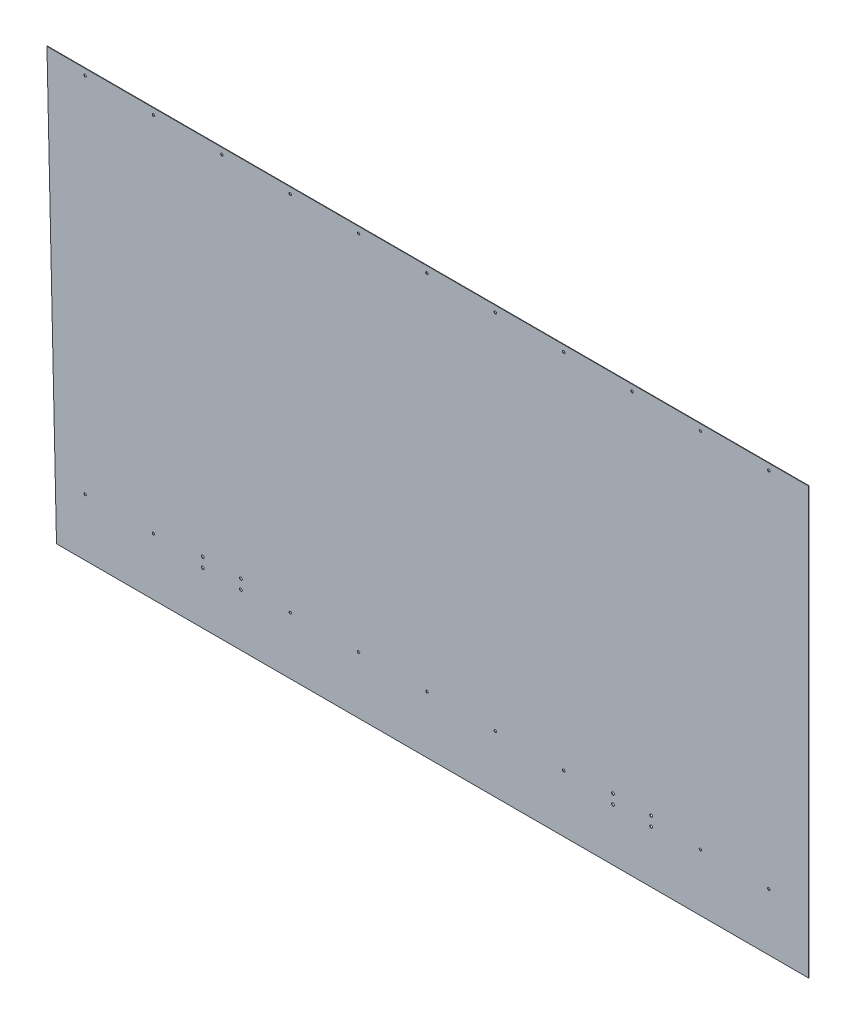
ISO-10303-21;
HEADER;
FILE_DESCRIPTION(('STEP AP214'),'2;1');
FILE_NAME('part.step','',(''),(''),'','','');
FILE_SCHEMA(('AUTOMOTIVE_DESIGN { 1 0 10303 214 1 1 1 1 }'));
ENDSEC;
DATA;
#1=APPLICATION_CONTEXT('core data for automotive mechanical design processes');
#2=APPLICATION_PROTOCOL_DEFINITION('international standard','automotive_design',2000,#1);
#3=PRODUCT_CONTEXT('',#1,'mechanical');
#4=PRODUCT('Part','Part','',(#3));
#5=PRODUCT_RELATED_PRODUCT_CATEGORY('part','',(#4));
#6=PRODUCT_DEFINITION_FORMATION('','',#4);
#7=PRODUCT_DEFINITION_CONTEXT('part definition',#1,'design');
#8=PRODUCT_DEFINITION('design','',#6,#7);
#9=PRODUCT_DEFINITION_SHAPE('','',#8);
#10=(LENGTH_UNIT() NAMED_UNIT(*) SI_UNIT(.MILLI.,.METRE.));
#11=(NAMED_UNIT(*) PLANE_ANGLE_UNIT() SI_UNIT($,.RADIAN.));
#12=(NAMED_UNIT(*) SI_UNIT($,.STERADIAN.) SOLID_ANGLE_UNIT());
#13=UNCERTAINTY_MEASURE_WITH_UNIT(LENGTH_MEASURE(1.E-05),#10,'distance_accuracy_value','');
#14=(GEOMETRIC_REPRESENTATION_CONTEXT(3) GLOBAL_UNCERTAINTY_ASSIGNED_CONTEXT((#13)) GLOBAL_UNIT_ASSIGNED_CONTEXT((#10,
#11,#12)) REPRESENTATION_CONTEXT('',''));
#15=CARTESIAN_POINT('',(0.,0.,0.));
#16=DIRECTION('',(0.,0.,1.));
#17=DIRECTION('',(1.,0.,0.));
#18=AXIS2_PLACEMENT_3D('',#15,#16,#17);
#19=CARTESIAN_POINT('',(-19.0500000000001,850.9,-1.01600000000003));
#20=DIRECTION('',(-0.999749481562088,-0.0223824510797483,0.));
#21=DIRECTION('',(0.0223824510797485,-0.999749481562088,0.));
#22=AXIS2_PLACEMENT_3D('',#19,#20,#21);
#23=PLANE('',#22);
#24=DIRECTION('',(0.0223824510797484,-0.999749481562088,0.));
#25=VECTOR('',#24,1.);
#26=CARTESIAN_POINT('',(-19.0500000000002,850.9,0.));
#27=LINE('',#26,#25);
#28=CARTESIAN_POINT('',(-19.0500000000002,850.9,0.));
#29=VERTEX_POINT('',#28);
#30=CARTESIAN_POINT('',(0.,0.,0.));
#31=VERTEX_POINT('',#30);
#32=EDGE_CURVE('E74',#29,#31,#27,.T.);
#33=ORIENTED_EDGE('',*,*,#32,.F.);
#34=DIRECTION('',(0.,0.,1.));
#35=VECTOR('',#34,1.);
#36=CARTESIAN_POINT('',(-19.0500000000001,850.9,-1.01600000000003));
#37=LINE('',#36,#35);
#38=CARTESIAN_POINT('',(-19.0500000000001,850.9,-1.01600000000003));
#39=VERTEX_POINT('',#38);
#40=EDGE_CURVE('E11',#39,#29,#37,.T.);
#41=ORIENTED_EDGE('',*,*,#40,.F.);
#42=DIRECTION('',(0.0223824510797484,-0.999749481562088,0.));
#43=VECTOR('',#42,1.);
#44=CARTESIAN_POINT('',(-19.0500000000001,850.9,-1.01600000000003));
#45=LINE('',#44,#43);
#46=CARTESIAN_POINT('',(0.,0.,-1.016));
#47=VERTEX_POINT('',#46);
#48=EDGE_CURVE('E76',#39,#47,#45,.T.);
#49=ORIENTED_EDGE('',*,*,#48,.T.);
#50=DIRECTION('',(0.,0.,1.));
#51=VECTOR('',#50,1.);
#52=CARTESIAN_POINT('',(0.,0.,-1.016));
#53=LINE('',#52,#51);
#54=EDGE_CURVE('E37',#47,#31,#53,.T.);
#55=ORIENTED_EDGE('',*,*,#54,.T.);
#56=EDGE_LOOP('',(#33,#41,#49,#55));
#57=FACE_BOUND('',#56,.T.);
#58=ADVANCED_FACE('F34',(#57),#23,.T.);
#59=CARTESIAN_POINT('',(1501.775,850.9,-1.01599999999996));
#60=DIRECTION('',(0.,1.,0.));
#61=DIRECTION('',(-1.,0.,0.));
#62=AXIS2_PLACEMENT_3D('',#59,#60,#61);
#63=PLANE('',#62);
#64=DIRECTION('',(-1.,0.,0.));
#65=VECTOR('',#64,1.);
#66=CARTESIAN_POINT('',(1501.775,850.9,0.));
#67=LINE('',#66,#65);
#68=CARTESIAN_POINT('',(1501.775,850.9,0.));
#69=VERTEX_POINT('',#68);
#70=EDGE_CURVE('E91',#69,#29,#67,.T.);
#71=ORIENTED_EDGE('',*,*,#70,.F.);
#72=DIRECTION('',(0.,0.,1.));
#73=VECTOR('',#72,1.);
#74=CARTESIAN_POINT('',(1501.775,850.9,-1.01599999999996));
#75=LINE('',#74,#73);
#76=CARTESIAN_POINT('',(1501.775,850.9,-1.01599999999996));
#77=VERTEX_POINT('',#76);
#78=EDGE_CURVE('E42',#77,#69,#75,.T.);
#79=ORIENTED_EDGE('',*,*,#78,.F.);
#80=DIRECTION('',(-1.,0.,0.));
#81=VECTOR('',#80,1.);
#82=CARTESIAN_POINT('',(1501.775,850.9,-1.01599999999996));
#83=LINE('',#82,#81);
#84=EDGE_CURVE('E81',#77,#39,#83,.T.);
#85=ORIENTED_EDGE('',*,*,#84,.T.);
#86=ORIENTED_EDGE('',*,*,#40,.T.);
#87=EDGE_LOOP('',(#71,#79,#85,#86));
#88=FACE_BOUND('',#87,.T.);
#89=ADVANCED_FACE('F111',(#88),#63,.T.);
#90=CARTESIAN_POINT('',(1501.775,-1.11022302462516E-13,-1.01599999999993));
#91=DIRECTION('',(1.,0.,0.));
#92=DIRECTION('',(0.,0.,-1.));
#93=AXIS2_PLACEMENT_3D('',#90,#91,#92);
#94=PLANE('',#93);
#95=DIRECTION('',(0.,1.,0.));
#96=VECTOR('',#95,1.);
#97=CARTESIAN_POINT('',(1501.775,-1.11022302462516E-13,0.));
#98=LINE('',#97,#96);
#99=CARTESIAN_POINT('',(1501.775,-1.11022302462516E-13,0.));
#100=VERTEX_POINT('',#99);
#101=EDGE_CURVE('E88',#100,#69,#98,.T.);
#102=ORIENTED_EDGE('',*,*,#101,.F.);
#103=DIRECTION('',(0.,0.,1.));
#104=VECTOR('',#103,1.);
#105=CARTESIAN_POINT('',(1501.775,-1.11022302462516E-13,-1.01599999999993));
#106=LINE('',#105,#104);
#107=CARTESIAN_POINT('',(1501.775,-1.11022302462516E-13,-1.01599999999993));
#108=VERTEX_POINT('',#107);
#109=EDGE_CURVE('E80',#108,#100,#106,.T.);
#110=ORIENTED_EDGE('',*,*,#109,.F.);
#111=DIRECTION('',(0.,1.,0.));
#112=VECTOR('',#111,1.);
#113=CARTESIAN_POINT('',(1501.775,-1.11022302462516E-13,-1.01599999999993));
#114=LINE('',#113,#112);
#115=EDGE_CURVE('E104',#108,#77,#114,.T.);
#116=ORIENTED_EDGE('',*,*,#115,.T.);
#117=ORIENTED_EDGE('',*,*,#78,.T.);
#118=EDGE_LOOP('',(#102,#110,#116,#117));
#119=FACE_BOUND('',#118,.T.);
#120=ADVANCED_FACE('F108',(#119),#94,.T.);
#121=CARTESIAN_POINT('',(0.,0.,-1.016));
#122=DIRECTION('',(0.,-1.,0.));
#123=DIRECTION('',(0.,0.,-1.));
#124=AXIS2_PLACEMENT_3D('',#121,#122,#123);
#125=PLANE('',#124);
#126=DIRECTION('',(1.,0.,0.));
#127=VECTOR('',#126,1.);
#128=CARTESIAN_POINT('',(0.,0.,0.));
#129=LINE('',#128,#127);
#130=EDGE_CURVE('E83',#31,#100,#129,.T.);
#131=ORIENTED_EDGE('',*,*,#130,.F.);
#132=ORIENTED_EDGE('',*,*,#54,.F.);
#133=DIRECTION('',(1.,0.,0.));
#134=VECTOR('',#133,1.);
#135=CARTESIAN_POINT('',(0.,0.,-1.016));
#136=LINE('',#135,#134);
#137=EDGE_CURVE('E102',#47,#108,#136,.T.);
#138=ORIENTED_EDGE('',*,*,#137,.T.);
#139=ORIENTED_EDGE('',*,*,#109,.T.);
#140=EDGE_LOOP('',(#131,#132,#138,#139));
#141=FACE_BOUND('',#140,.T.);
#142=ADVANCED_FACE('F84',(#141),#125,.T.);
#143=CARTESIAN_POINT('',(-19.05,850.9,-1.01600000000002));
#144=DIRECTION('',(0.,0.,-1.));
#145=DIRECTION('',(-1.,0.,0.));
#146=AXIS2_PLACEMENT_3D('',#143,#144,#145);
#147=PLANE('',#146);
#148=CARTESIAN_POINT('',(1422.4,838.2,-1.01600000000002));
#149=DIRECTION('',(0.,0.,1.));
#150=DIRECTION('',(1.,0.,0.));
#151=AXIS2_PLACEMENT_3D('',#148,#149,#150);
#152=CIRCLE('',#151,2.42570000000007);
#153=CARTESIAN_POINT('',(1424.8257,838.2,-1.01600000000002));
#154=VERTEX_POINT('',#153);
#155=EDGE_CURVE('E436',#154,#154,#152,.T.);
#156=ORIENTED_EDGE('',*,*,#155,.T.);
#157=EDGE_LOOP('',(#156));
#158=FACE_BOUND('',#157,.T.);
#159=CARTESIAN_POINT('',(1285.875,838.2,-1.01600000000002));
#160=DIRECTION('',(0.,0.,1.));
#161=DIRECTION('',(1.,0.,0.));
#162=AXIS2_PLACEMENT_3D('',#159,#160,#161);
#163=CIRCLE('',#162,2.42570000000007);
#164=CARTESIAN_POINT('',(1288.3007,838.2,-1.01600000000002));
#165=VERTEX_POINT('',#164);
#166=EDGE_CURVE('E446',#165,#165,#163,.T.);
#167=ORIENTED_EDGE('',*,*,#166,.T.);
#168=EDGE_LOOP('',(#167));
#169=FACE_BOUND('',#168,.T.);
#170=CARTESIAN_POINT('',(1149.35,838.2,-1.01599999999998));
#171=DIRECTION('',(0.,0.,1.));
#172=DIRECTION('',(1.,0.,0.));
#173=AXIS2_PLACEMENT_3D('',#170,#171,#172);
#174=CIRCLE('',#173,2.42570000000007);
#175=CARTESIAN_POINT('',(1151.7757,838.2,-1.01599999999998));
#176=VERTEX_POINT('',#175);
#177=EDGE_CURVE('E452',#176,#176,#174,.T.);
#178=ORIENTED_EDGE('',*,*,#177,.T.);
#179=EDGE_LOOP('',(#178));
#180=FACE_BOUND('',#179,.T.);
#181=CARTESIAN_POINT('',(1012.825,838.2,-1.01599999999996));
#182=DIRECTION('',(0.,0.,1.));
#183=DIRECTION('',(1.,0.,0.));
#184=AXIS2_PLACEMENT_3D('',#181,#182,#183);
#185=CIRCLE('',#184,2.42569999999986);
#186=CARTESIAN_POINT('',(1015.2507,838.2,-1.01599999999996));
#187=VERTEX_POINT('',#186);
#188=EDGE_CURVE('E458',#187,#187,#185,.T.);
#189=ORIENTED_EDGE('',*,*,#188,.T.);
#190=EDGE_LOOP('',(#189));
#191=FACE_BOUND('',#190,.T.);
#192=CARTESIAN_POINT('',(876.3,838.2,-1.01599999999999));
#193=DIRECTION('',(0.,0.,1.));
#194=DIRECTION('',(1.,0.,0.));
#195=AXIS2_PLACEMENT_3D('',#192,#193,#194);
#196=CIRCLE('',#195,2.42569999999997);
#197=CARTESIAN_POINT('',(878.7257,838.2,-1.01599999999999));
#198=VERTEX_POINT('',#197);
#199=EDGE_CURVE('E464',#198,#198,#196,.T.);
#200=ORIENTED_EDGE('',*,*,#199,.T.);
#201=EDGE_LOOP('',(#200));
#202=FACE_BOUND('',#201,.T.);
#203=CARTESIAN_POINT('',(739.775,838.2,-1.01599999999996));
#204=DIRECTION('',(0.,0.,1.));
#205=DIRECTION('',(1.,0.,0.));
#206=AXIS2_PLACEMENT_3D('',#203,#204,#205);
#207=CIRCLE('',#206,2.42569999999997);
#208=CARTESIAN_POINT('',(742.2007,838.2,-1.01599999999996));
#209=VERTEX_POINT('',#208);
#210=EDGE_CURVE('E470',#209,#209,#207,.T.);
#211=ORIENTED_EDGE('',*,*,#210,.T.);
#212=EDGE_LOOP('',(#211));
#213=FACE_BOUND('',#212,.T.);
#214=CARTESIAN_POINT('',(603.25,838.2,-1.01599999999999));
#215=DIRECTION('',(0.,0.,1.));
#216=DIRECTION('',(1.,0.,0.));
#217=AXIS2_PLACEMENT_3D('',#214,#215,#216);
#218=CIRCLE('',#217,2.42569999999997);
#219=CARTESIAN_POINT('',(605.6757,838.2,-1.01599999999999));
#220=VERTEX_POINT('',#219);
#221=EDGE_CURVE('E476',#220,#220,#218,.T.);
#222=ORIENTED_EDGE('',*,*,#221,.T.);
#223=EDGE_LOOP('',(#222));
#224=FACE_BOUND('',#223,.T.);
#225=CARTESIAN_POINT('',(466.725,838.2,-1.01599999999999));
#226=DIRECTION('',(0.,0.,1.));
#227=DIRECTION('',(1.,0.,0.));
#228=AXIS2_PLACEMENT_3D('',#225,#226,#227);
#229=CIRCLE('',#228,2.42569999999997);
#230=CARTESIAN_POINT('',(469.1507,838.2,-1.01599999999999));
#231=VERTEX_POINT('',#230);
#232=EDGE_CURVE('E482',#231,#231,#229,.T.);
#233=ORIENTED_EDGE('',*,*,#232,.T.);
#234=EDGE_LOOP('',(#233));
#235=FACE_BOUND('',#234,.T.);
#236=CARTESIAN_POINT('',(330.2,838.2,-1.016));
#237=DIRECTION('',(0.,0.,1.));
#238=DIRECTION('',(1.,0.,0.));
#239=AXIS2_PLACEMENT_3D('',#236,#237,#238);
#240=CIRCLE('',#239,2.42569999999997);
#241=CARTESIAN_POINT('',(332.6257,838.2,-1.016));
#242=VERTEX_POINT('',#241);
#243=EDGE_CURVE('E488',#242,#242,#240,.T.);
#244=ORIENTED_EDGE('',*,*,#243,.T.);
#245=EDGE_LOOP('',(#244));
#246=FACE_BOUND('',#245,.T.);
#247=CARTESIAN_POINT('',(193.675,838.2,-1.01599999999999));
#248=DIRECTION('',(0.,0.,1.));
#249=DIRECTION('',(1.,0.,0.));
#250=AXIS2_PLACEMENT_3D('',#247,#248,#249);
#251=CIRCLE('',#250,2.42569999999999);
#252=CARTESIAN_POINT('',(196.1007,838.2,-1.01599999999999));
#253=VERTEX_POINT('',#252);
#254=EDGE_CURVE('E494',#253,#253,#251,.T.);
#255=ORIENTED_EDGE('',*,*,#254,.T.);
#256=EDGE_LOOP('',(#255));
#257=FACE_BOUND('',#256,.T.);
#258=CARTESIAN_POINT('',(57.1499999999998,838.2,-1.016));
#259=DIRECTION('',(0.,0.,1.));
#260=DIRECTION('',(1.,0.,0.));
#261=AXIS2_PLACEMENT_3D('',#258,#259,#260);
#262=CIRCLE('',#261,2.42569999999997);
#263=CARTESIAN_POINT('',(59.5756999999998,838.2,-1.016));
#264=VERTEX_POINT('',#263);
#265=EDGE_CURVE('E500',#264,#264,#262,.T.);
#266=ORIENTED_EDGE('',*,*,#265,.T.);
#267=EDGE_LOOP('',(#266));
#268=FACE_BOUND('',#267,.T.);
#269=CARTESIAN_POINT('',(1012.825,114.3,-1.01599999999998));
#270=DIRECTION('',(0.,0.,1.));
#271=DIRECTION('',(1.,0.,0.));
#272=AXIS2_PLACEMENT_3D('',#269,#270,#271);
#273=CIRCLE('',#272,2.38759999999994);
#274=CARTESIAN_POINT('',(1015.2126,114.3,-1.01599999999998));
#275=VERTEX_POINT('',#274);
#276=EDGE_CURVE('E506',#275,#275,#273,.T.);
#277=ORIENTED_EDGE('',*,*,#276,.T.);
#278=EDGE_LOOP('',(#277));
#279=FACE_BOUND('',#278,.T.);
#280=CARTESIAN_POINT('',(1187.45,104.775,-1.01599999999991));
#281=DIRECTION('',(0.,0.,1.));
#282=DIRECTION('',(1.,0.,0.));
#283=AXIS2_PLACEMENT_3D('',#280,#281,#282);
#284=CIRCLE('',#283,2.78130000000002);
#285=CARTESIAN_POINT('',(1190.2313,104.775,-1.01599999999991));
#286=VERTEX_POINT('',#285);
#287=EDGE_CURVE('E512',#286,#286,#284,.T.);
#288=ORIENTED_EDGE('',*,*,#287,.T.);
#289=EDGE_LOOP('',(#288));
#290=FACE_BOUND('',#289,.T.);
#291=CARTESIAN_POINT('',(1187.45,123.825,-1.01599999999991));
#292=DIRECTION('',(0.,0.,1.));
#293=DIRECTION('',(1.,0.,0.));
#294=AXIS2_PLACEMENT_3D('',#291,#292,#293);
#295=CIRCLE('',#294,2.78130000000002);
#296=CARTESIAN_POINT('',(1190.2313,123.825,-1.01599999999991));
#297=VERTEX_POINT('',#296);
#298=EDGE_CURVE('E518',#297,#297,#295,.T.);
#299=ORIENTED_EDGE('',*,*,#298,.T.);
#300=EDGE_LOOP('',(#299));
#301=FACE_BOUND('',#300,.T.);
#302=CARTESIAN_POINT('',(1285.875,114.3,-1.01599999999996));
#303=DIRECTION('',(0.,0.,1.));
#304=DIRECTION('',(1.,0.,0.));
#305=AXIS2_PLACEMENT_3D('',#302,#303,#304);
#306=CIRCLE('',#305,2.38759999999994);
#307=CARTESIAN_POINT('',(1288.2626,114.3,-1.01599999999996));
#308=VERTEX_POINT('',#307);
#309=EDGE_CURVE('E524',#308,#308,#306,.T.);
#310=ORIENTED_EDGE('',*,*,#309,.T.);
#311=EDGE_LOOP('',(#310));
#312=FACE_BOUND('',#311,.T.);
#313=CARTESIAN_POINT('',(876.3,114.3,-1.01599999999999));
#314=DIRECTION('',(0.,0.,1.));
#315=DIRECTION('',(1.,0.,0.));
#316=AXIS2_PLACEMENT_3D('',#313,#314,#315);
#317=CIRCLE('',#316,2.38760000000005);
#318=CARTESIAN_POINT('',(878.6876,114.3,-1.01599999999999));
#319=VERTEX_POINT('',#318);
#320=EDGE_CURVE('E530',#319,#319,#317,.T.);
#321=ORIENTED_EDGE('',*,*,#320,.T.);
#322=EDGE_LOOP('',(#321));
#323=FACE_BOUND('',#322,.T.);
#324=CARTESIAN_POINT('',(368.3,123.825,-1.01599999999999));
#325=DIRECTION('',(0.,0.,1.));
#326=DIRECTION('',(1.,0.,0.));
#327=AXIS2_PLACEMENT_3D('',#324,#325,#326);
#328=CIRCLE('',#327,2.78130000000001);
#329=CARTESIAN_POINT('',(371.0813,123.825,-1.01599999999999));
#330=VERTEX_POINT('',#329);
#331=EDGE_CURVE('E536',#330,#330,#328,.T.);
#332=ORIENTED_EDGE('',*,*,#331,.T.);
#333=EDGE_LOOP('',(#332));
#334=FACE_BOUND('',#333,.T.);
#335=CARTESIAN_POINT('',(368.3,104.775,-1.016));
#336=DIRECTION('',(0.,0.,1.));
#337=DIRECTION('',(1.,0.,0.));
#338=AXIS2_PLACEMENT_3D('',#335,#336,#337);
#339=CIRCLE('',#338,2.78130000000001);
#340=CARTESIAN_POINT('',(371.0813,104.775,-1.016));
#341=VERTEX_POINT('',#340);
#342=EDGE_CURVE('E542',#341,#341,#339,.T.);
#343=ORIENTED_EDGE('',*,*,#342,.T.);
#344=EDGE_LOOP('',(#343));
#345=FACE_BOUND('',#344,.T.);
#346=CARTESIAN_POINT('',(1422.4,114.3,-1.01599999999996));
#347=DIRECTION('',(0.,0.,1.));
#348=DIRECTION('',(1.,0.,0.));
#349=AXIS2_PLACEMENT_3D('',#346,#347,#348);
#350=CIRCLE('',#349,2.38759999999994);
#351=CARTESIAN_POINT('',(1424.7876,114.3,-1.01599999999996));
#352=VERTEX_POINT('',#351);
#353=EDGE_CURVE('E548',#352,#352,#350,.T.);
#354=ORIENTED_EDGE('',*,*,#353,.T.);
#355=EDGE_LOOP('',(#354));
#356=FACE_BOUND('',#355,.T.);
#357=CARTESIAN_POINT('',(1111.25,104.775,-1.01599999999991));
#358=DIRECTION('',(0.,0.,1.));
#359=DIRECTION('',(1.,0.,0.));
#360=AXIS2_PLACEMENT_3D('',#357,#358,#359);
#361=CIRCLE('',#360,2.78130000000002);
#362=CARTESIAN_POINT('',(1114.0313,104.775,-1.01599999999991));
#363=VERTEX_POINT('',#362);
#364=EDGE_CURVE('E554',#363,#363,#361,.T.);
#365=ORIENTED_EDGE('',*,*,#364,.T.);
#366=EDGE_LOOP('',(#365));
#367=FACE_BOUND('',#366,.T.);
#368=CARTESIAN_POINT('',(1111.25,123.825,-1.01599999999991));
#369=DIRECTION('',(0.,0.,1.));
#370=DIRECTION('',(1.,0.,0.));
#371=AXIS2_PLACEMENT_3D('',#368,#369,#370);
#372=CIRCLE('',#371,2.78130000000002);
#373=CARTESIAN_POINT('',(1114.0313,123.825,-1.01599999999991));
#374=VERTEX_POINT('',#373);
#375=EDGE_CURVE('E560',#374,#374,#372,.T.);
#376=ORIENTED_EDGE('',*,*,#375,.T.);
#377=EDGE_LOOP('',(#376));
#378=FACE_BOUND('',#377,.T.);
#379=CARTESIAN_POINT('',(739.775,114.3,-1.01599999999996));
#380=DIRECTION('',(0.,0.,1.));
#381=DIRECTION('',(1.,0.,0.));
#382=AXIS2_PLACEMENT_3D('',#379,#380,#381);
#383=CIRCLE('',#382,2.38760000000005);
#384=CARTESIAN_POINT('',(742.1626,114.3,-1.01599999999996));
#385=VERTEX_POINT('',#384);
#386=EDGE_CURVE('E566',#385,#385,#383,.T.);
#387=ORIENTED_EDGE('',*,*,#386,.T.);
#388=EDGE_LOOP('',(#387));
#389=FACE_BOUND('',#388,.T.);
#390=CARTESIAN_POINT('',(603.25,114.3,-1.01599999999999));
#391=DIRECTION('',(0.,0.,1.));
#392=DIRECTION('',(1.,0.,0.));
#393=AXIS2_PLACEMENT_3D('',#390,#391,#392);
#394=CIRCLE('',#393,2.38760000000005);
#395=CARTESIAN_POINT('',(605.6376,114.3,-1.01599999999999));
#396=VERTEX_POINT('',#395);
#397=EDGE_CURVE('E572',#396,#396,#394,.T.);
#398=ORIENTED_EDGE('',*,*,#397,.T.);
#399=EDGE_LOOP('',(#398));
#400=FACE_BOUND('',#399,.T.);
#401=CARTESIAN_POINT('',(466.725,114.3,-1.016));
#402=DIRECTION('',(0.,0.,1.));
#403=DIRECTION('',(1.,0.,0.));
#404=AXIS2_PLACEMENT_3D('',#401,#402,#403);
#405=CIRCLE('',#404,2.38760000000005);
#406=CARTESIAN_POINT('',(469.1126,114.3,-1.016));
#407=VERTEX_POINT('',#406);
#408=EDGE_CURVE('E578',#407,#407,#405,.T.);
#409=ORIENTED_EDGE('',*,*,#408,.T.);
#410=EDGE_LOOP('',(#409));
#411=FACE_BOUND('',#410,.T.);
#412=CARTESIAN_POINT('',(193.675,114.3,-1.01599999999999));
#413=DIRECTION('',(0.,0.,1.));
#414=DIRECTION('',(1.,0.,0.));
#415=AXIS2_PLACEMENT_3D('',#412,#413,#414);
#416=CIRCLE('',#415,2.38759999999999);
#417=CARTESIAN_POINT('',(196.0626,114.3,-1.01599999999999));
#418=VERTEX_POINT('',#417);
#419=EDGE_CURVE('E584',#418,#418,#416,.T.);
#420=ORIENTED_EDGE('',*,*,#419,.T.);
#421=EDGE_LOOP('',(#420));
#422=FACE_BOUND('',#421,.T.);
#423=CARTESIAN_POINT('',(292.1,123.825,-1.016));
#424=DIRECTION('',(0.,0.,1.));
#425=DIRECTION('',(1.,0.,0.));
#426=AXIS2_PLACEMENT_3D('',#423,#424,#425);
#427=CIRCLE('',#426,2.78130000000001);
#428=CARTESIAN_POINT('',(294.8813,123.825,-1.016));
#429=VERTEX_POINT('',#428);
#430=EDGE_CURVE('E590',#429,#429,#427,.T.);
#431=ORIENTED_EDGE('',*,*,#430,.T.);
#432=EDGE_LOOP('',(#431));
#433=FACE_BOUND('',#432,.T.);
#434=CARTESIAN_POINT('',(292.1,104.775,-1.016));
#435=DIRECTION('',(0.,0.,1.));
#436=DIRECTION('',(1.,0.,0.));
#437=AXIS2_PLACEMENT_3D('',#434,#435,#436);
#438=CIRCLE('',#437,2.78130000000001);
#439=CARTESIAN_POINT('',(294.8813,104.775,-1.016));
#440=VERTEX_POINT('',#439);
#441=EDGE_CURVE('E596',#440,#440,#438,.T.);
#442=ORIENTED_EDGE('',*,*,#441,.T.);
#443=EDGE_LOOP('',(#442));
#444=FACE_BOUND('',#443,.T.);
#445=CARTESIAN_POINT('',(57.1499999999999,114.3,-1.01599999999999));
#446=DIRECTION('',(0.,0.,1.));
#447=DIRECTION('',(1.,0.,0.));
#448=AXIS2_PLACEMENT_3D('',#445,#446,#447);
#449=CIRCLE('',#448,2.3876);
#450=CARTESIAN_POINT('',(59.5375999999999,114.3,-1.01599999999999));
#451=VERTEX_POINT('',#450);
#452=EDGE_CURVE('E92',#451,#451,#449,.T.);
#453=ORIENTED_EDGE('',*,*,#452,.T.);
#454=EDGE_LOOP('',(#453));
#455=FACE_BOUND('',#454,.T.);
#456=ORIENTED_EDGE('',*,*,#48,.F.);
#457=ORIENTED_EDGE('',*,*,#84,.F.);
#458=ORIENTED_EDGE('',*,*,#115,.F.);
#459=ORIENTED_EDGE('',*,*,#137,.F.);
#460=EDGE_LOOP('',(#456,#457,#458,#459));
#461=FACE_BOUND('',#460,.T.);
#462=ADVANCED_FACE('F113',(#158,#169,#180,#191,#202,#213,#224,#235,#246,#257,#268,#279,#290,
#301,#312,#323,#334,#345,#356,#367,#378,#389,#400,#411,#422,#433,#444,#455,#461),#147,.T.);
#463=CARTESIAN_POINT('',(-19.05,850.9,0.));
#464=DIRECTION('',(0.,0.,-1.));
#465=DIRECTION('',(-1.,0.,0.));
#466=AXIS2_PLACEMENT_3D('',#463,#464,#465);
#467=PLANE('',#466);
#468=CARTESIAN_POINT('',(1422.4,838.2,0.));
#469=DIRECTION('',(0.,0.,1.));
#470=DIRECTION('',(1.,0.,0.));
#471=AXIS2_PLACEMENT_3D('',#468,#469,#470);
#472=CIRCLE('',#471,2.42570000000007);
#473=CARTESIAN_POINT('',(1424.8257,838.2,0.));
#474=VERTEX_POINT('',#473);
#475=EDGE_CURVE('E439',#474,#474,#472,.T.);
#476=ORIENTED_EDGE('',*,*,#475,.F.);
#477=EDGE_LOOP('',(#476));
#478=FACE_BOUND('',#477,.T.);
#479=CARTESIAN_POINT('',(1285.875,838.2,0.));
#480=DIRECTION('',(0.,0.,1.));
#481=DIRECTION('',(1.,0.,0.));
#482=AXIS2_PLACEMENT_3D('',#479,#480,#481);
#483=CIRCLE('',#482,2.42570000000007);
#484=CARTESIAN_POINT('',(1288.3007,838.2,0.));
#485=VERTEX_POINT('',#484);
#486=EDGE_CURVE('E441',#485,#485,#483,.T.);
#487=ORIENTED_EDGE('',*,*,#486,.F.);
#488=EDGE_LOOP('',(#487));
#489=FACE_BOUND('',#488,.T.);
#490=CARTESIAN_POINT('',(1149.35,838.2,0.));
#491=DIRECTION('',(0.,0.,1.));
#492=DIRECTION('',(1.,0.,0.));
#493=AXIS2_PLACEMENT_3D('',#490,#491,#492);
#494=CIRCLE('',#493,2.42570000000007);
#495=CARTESIAN_POINT('',(1151.7757,838.2,0.));
#496=VERTEX_POINT('',#495);
#497=EDGE_CURVE('E449',#496,#496,#494,.T.);
#498=ORIENTED_EDGE('',*,*,#497,.F.);
#499=EDGE_LOOP('',(#498));
#500=FACE_BOUND('',#499,.T.);
#501=CARTESIAN_POINT('',(1012.825,838.2,0.));
#502=DIRECTION('',(0.,0.,1.));
#503=DIRECTION('',(1.,0.,0.));
#504=AXIS2_PLACEMENT_3D('',#501,#502,#503);
#505=CIRCLE('',#504,2.42569999999986);
#506=CARTESIAN_POINT('',(1015.2507,838.2,0.));
#507=VERTEX_POINT('',#506);
#508=EDGE_CURVE('E455',#507,#507,#505,.T.);
#509=ORIENTED_EDGE('',*,*,#508,.F.);
#510=EDGE_LOOP('',(#509));
#511=FACE_BOUND('',#510,.T.);
#512=CARTESIAN_POINT('',(876.3,838.2,0.));
#513=DIRECTION('',(0.,0.,1.));
#514=DIRECTION('',(1.,0.,0.));
#515=AXIS2_PLACEMENT_3D('',#512,#513,#514);
#516=CIRCLE('',#515,2.42569999999997);
#517=CARTESIAN_POINT('',(878.7257,838.2,0.));
#518=VERTEX_POINT('',#517);
#519=EDGE_CURVE('E461',#518,#518,#516,.T.);
#520=ORIENTED_EDGE('',*,*,#519,.F.);
#521=EDGE_LOOP('',(#520));
#522=FACE_BOUND('',#521,.T.);
#523=CARTESIAN_POINT('',(739.775,838.2,0.));
#524=DIRECTION('',(0.,0.,1.));
#525=DIRECTION('',(1.,0.,0.));
#526=AXIS2_PLACEMENT_3D('',#523,#524,#525);
#527=CIRCLE('',#526,2.42569999999997);
#528=CARTESIAN_POINT('',(742.2007,838.2,0.));
#529=VERTEX_POINT('',#528);
#530=EDGE_CURVE('E467',#529,#529,#527,.T.);
#531=ORIENTED_EDGE('',*,*,#530,.F.);
#532=EDGE_LOOP('',(#531));
#533=FACE_BOUND('',#532,.T.);
#534=CARTESIAN_POINT('',(603.25,838.2,0.));
#535=DIRECTION('',(0.,0.,1.));
#536=DIRECTION('',(1.,0.,0.));
#537=AXIS2_PLACEMENT_3D('',#534,#535,#536);
#538=CIRCLE('',#537,2.42569999999997);
#539=CARTESIAN_POINT('',(605.6757,838.2,0.));
#540=VERTEX_POINT('',#539);
#541=EDGE_CURVE('E473',#540,#540,#538,.T.);
#542=ORIENTED_EDGE('',*,*,#541,.F.);
#543=EDGE_LOOP('',(#542));
#544=FACE_BOUND('',#543,.T.);
#545=CARTESIAN_POINT('',(466.725,838.2,0.));
#546=DIRECTION('',(0.,0.,1.));
#547=DIRECTION('',(1.,0.,0.));
#548=AXIS2_PLACEMENT_3D('',#545,#546,#547);
#549=CIRCLE('',#548,2.42569999999997);
#550=CARTESIAN_POINT('',(469.1507,838.2,0.));
#551=VERTEX_POINT('',#550);
#552=EDGE_CURVE('E479',#551,#551,#549,.T.);
#553=ORIENTED_EDGE('',*,*,#552,.F.);
#554=EDGE_LOOP('',(#553));
#555=FACE_BOUND('',#554,.T.);
#556=CARTESIAN_POINT('',(330.2,838.2,0.));
#557=DIRECTION('',(0.,0.,1.));
#558=DIRECTION('',(1.,0.,0.));
#559=AXIS2_PLACEMENT_3D('',#556,#557,#558);
#560=CIRCLE('',#559,2.42569999999997);
#561=CARTESIAN_POINT('',(332.6257,838.2,0.));
#562=VERTEX_POINT('',#561);
#563=EDGE_CURVE('E485',#562,#562,#560,.T.);
#564=ORIENTED_EDGE('',*,*,#563,.F.);
#565=EDGE_LOOP('',(#564));
#566=FACE_BOUND('',#565,.T.);
#567=CARTESIAN_POINT('',(193.675,838.2,0.));
#568=DIRECTION('',(0.,0.,1.));
#569=DIRECTION('',(1.,0.,0.));
#570=AXIS2_PLACEMENT_3D('',#567,#568,#569);
#571=CIRCLE('',#570,2.42569999999999);
#572=CARTESIAN_POINT('',(196.1007,838.2,0.));
#573=VERTEX_POINT('',#572);
#574=EDGE_CURVE('E491',#573,#573,#571,.T.);
#575=ORIENTED_EDGE('',*,*,#574,.F.);
#576=EDGE_LOOP('',(#575));
#577=FACE_BOUND('',#576,.T.);
#578=CARTESIAN_POINT('',(57.1499999999999,838.2,0.));
#579=DIRECTION('',(0.,0.,1.));
#580=DIRECTION('',(1.,0.,0.));
#581=AXIS2_PLACEMENT_3D('',#578,#579,#580);
#582=CIRCLE('',#581,2.42569999999997);
#583=CARTESIAN_POINT('',(59.5756999999999,838.2,0.));
#584=VERTEX_POINT('',#583);
#585=EDGE_CURVE('E497',#584,#584,#582,.T.);
#586=ORIENTED_EDGE('',*,*,#585,.F.);
#587=EDGE_LOOP('',(#586));
#588=FACE_BOUND('',#587,.T.);
#589=CARTESIAN_POINT('',(1012.825,114.3,0.));
#590=DIRECTION('',(0.,0.,1.));
#591=DIRECTION('',(1.,0.,0.));
#592=AXIS2_PLACEMENT_3D('',#589,#590,#591);
#593=CIRCLE('',#592,2.38759999999994);
#594=CARTESIAN_POINT('',(1015.2126,114.3,0.));
#595=VERTEX_POINT('',#594);
#596=EDGE_CURVE('E503',#595,#595,#593,.T.);
#597=ORIENTED_EDGE('',*,*,#596,.F.);
#598=EDGE_LOOP('',(#597));
#599=FACE_BOUND('',#598,.T.);
#600=CARTESIAN_POINT('',(1187.45,104.775,0.));
#601=DIRECTION('',(0.,0.,1.));
#602=DIRECTION('',(1.,0.,0.));
#603=AXIS2_PLACEMENT_3D('',#600,#601,#602);
#604=CIRCLE('',#603,2.78130000000002);
#605=CARTESIAN_POINT('',(1190.2313,104.775,0.));
#606=VERTEX_POINT('',#605);
#607=EDGE_CURVE('E509',#606,#606,#604,.T.);
#608=ORIENTED_EDGE('',*,*,#607,.F.);
#609=EDGE_LOOP('',(#608));
#610=FACE_BOUND('',#609,.T.);
#611=CARTESIAN_POINT('',(1187.45,123.825,0.));
#612=DIRECTION('',(0.,0.,1.));
#613=DIRECTION('',(1.,0.,0.));
#614=AXIS2_PLACEMENT_3D('',#611,#612,#613);
#615=CIRCLE('',#614,2.78130000000002);
#616=CARTESIAN_POINT('',(1190.2313,123.825,0.));
#617=VERTEX_POINT('',#616);
#618=EDGE_CURVE('E515',#617,#617,#615,.T.);
#619=ORIENTED_EDGE('',*,*,#618,.F.);
#620=EDGE_LOOP('',(#619));
#621=FACE_BOUND('',#620,.T.);
#622=CARTESIAN_POINT('',(1285.875,114.3,0.));
#623=DIRECTION('',(0.,0.,1.));
#624=DIRECTION('',(1.,0.,0.));
#625=AXIS2_PLACEMENT_3D('',#622,#623,#624);
#626=CIRCLE('',#625,2.38759999999994);
#627=CARTESIAN_POINT('',(1288.2626,114.3,0.));
#628=VERTEX_POINT('',#627);
#629=EDGE_CURVE('E521',#628,#628,#626,.T.);
#630=ORIENTED_EDGE('',*,*,#629,.F.);
#631=EDGE_LOOP('',(#630));
#632=FACE_BOUND('',#631,.T.);
#633=CARTESIAN_POINT('',(876.3,114.3,0.));
#634=DIRECTION('',(0.,0.,1.));
#635=DIRECTION('',(1.,0.,0.));
#636=AXIS2_PLACEMENT_3D('',#633,#634,#635);
#637=CIRCLE('',#636,2.38760000000005);
#638=CARTESIAN_POINT('',(878.6876,114.3,0.));
#639=VERTEX_POINT('',#638);
#640=EDGE_CURVE('E527',#639,#639,#637,.T.);
#641=ORIENTED_EDGE('',*,*,#640,.F.);
#642=EDGE_LOOP('',(#641));
#643=FACE_BOUND('',#642,.T.);
#644=CARTESIAN_POINT('',(368.3,123.825,0.));
#645=DIRECTION('',(0.,0.,1.));
#646=DIRECTION('',(1.,0.,0.));
#647=AXIS2_PLACEMENT_3D('',#644,#645,#646);
#648=CIRCLE('',#647,2.78130000000001);
#649=CARTESIAN_POINT('',(371.0813,123.825,0.));
#650=VERTEX_POINT('',#649);
#651=EDGE_CURVE('E533',#650,#650,#648,.T.);
#652=ORIENTED_EDGE('',*,*,#651,.F.);
#653=EDGE_LOOP('',(#652));
#654=FACE_BOUND('',#653,.T.);
#655=CARTESIAN_POINT('',(368.3,104.775,0.));
#656=DIRECTION('',(0.,0.,1.));
#657=DIRECTION('',(1.,0.,0.));
#658=AXIS2_PLACEMENT_3D('',#655,#656,#657);
#659=CIRCLE('',#658,2.78130000000001);
#660=CARTESIAN_POINT('',(371.0813,104.775,0.));
#661=VERTEX_POINT('',#660);
#662=EDGE_CURVE('E539',#661,#661,#659,.T.);
#663=ORIENTED_EDGE('',*,*,#662,.F.);
#664=EDGE_LOOP('',(#663));
#665=FACE_BOUND('',#664,.T.);
#666=CARTESIAN_POINT('',(1422.4,114.3,0.));
#667=DIRECTION('',(0.,0.,1.));
#668=DIRECTION('',(1.,0.,0.));
#669=AXIS2_PLACEMENT_3D('',#666,#667,#668);
#670=CIRCLE('',#669,2.38759999999994);
#671=CARTESIAN_POINT('',(1424.7876,114.3,0.));
#672=VERTEX_POINT('',#671);
#673=EDGE_CURVE('E545',#672,#672,#670,.T.);
#674=ORIENTED_EDGE('',*,*,#673,.F.);
#675=EDGE_LOOP('',(#674));
#676=FACE_BOUND('',#675,.T.);
#677=CARTESIAN_POINT('',(1111.25,104.775,0.));
#678=DIRECTION('',(0.,0.,1.));
#679=DIRECTION('',(1.,0.,0.));
#680=AXIS2_PLACEMENT_3D('',#677,#678,#679);
#681=CIRCLE('',#680,2.78130000000002);
#682=CARTESIAN_POINT('',(1114.0313,104.775,0.));
#683=VERTEX_POINT('',#682);
#684=EDGE_CURVE('E551',#683,#683,#681,.T.);
#685=ORIENTED_EDGE('',*,*,#684,.F.);
#686=EDGE_LOOP('',(#685));
#687=FACE_BOUND('',#686,.T.);
#688=CARTESIAN_POINT('',(1111.25,123.825,0.));
#689=DIRECTION('',(0.,0.,1.));
#690=DIRECTION('',(1.,0.,0.));
#691=AXIS2_PLACEMENT_3D('',#688,#689,#690);
#692=CIRCLE('',#691,2.78130000000002);
#693=CARTESIAN_POINT('',(1114.0313,123.825,0.));
#694=VERTEX_POINT('',#693);
#695=EDGE_CURVE('E557',#694,#694,#692,.T.);
#696=ORIENTED_EDGE('',*,*,#695,.F.);
#697=EDGE_LOOP('',(#696));
#698=FACE_BOUND('',#697,.T.);
#699=CARTESIAN_POINT('',(739.775,114.3,0.));
#700=DIRECTION('',(0.,0.,1.));
#701=DIRECTION('',(1.,0.,0.));
#702=AXIS2_PLACEMENT_3D('',#699,#700,#701);
#703=CIRCLE('',#702,2.38760000000005);
#704=CARTESIAN_POINT('',(742.1626,114.3,0.));
#705=VERTEX_POINT('',#704);
#706=EDGE_CURVE('E563',#705,#705,#703,.T.);
#707=ORIENTED_EDGE('',*,*,#706,.F.);
#708=EDGE_LOOP('',(#707));
#709=FACE_BOUND('',#708,.T.);
#710=CARTESIAN_POINT('',(603.25,114.3,0.));
#711=DIRECTION('',(0.,0.,1.));
#712=DIRECTION('',(1.,0.,0.));
#713=AXIS2_PLACEMENT_3D('',#710,#711,#712);
#714=CIRCLE('',#713,2.38760000000005);
#715=CARTESIAN_POINT('',(605.6376,114.3,0.));
#716=VERTEX_POINT('',#715);
#717=EDGE_CURVE('E569',#716,#716,#714,.T.);
#718=ORIENTED_EDGE('',*,*,#717,.F.);
#719=EDGE_LOOP('',(#718));
#720=FACE_BOUND('',#719,.T.);
#721=CARTESIAN_POINT('',(466.725,114.3,0.));
#722=DIRECTION('',(0.,0.,1.));
#723=DIRECTION('',(1.,0.,0.));
#724=AXIS2_PLACEMENT_3D('',#721,#722,#723);
#725=CIRCLE('',#724,2.38760000000005);
#726=CARTESIAN_POINT('',(469.1126,114.3,0.));
#727=VERTEX_POINT('',#726);
#728=EDGE_CURVE('E575',#727,#727,#725,.T.);
#729=ORIENTED_EDGE('',*,*,#728,.F.);
#730=EDGE_LOOP('',(#729));
#731=FACE_BOUND('',#730,.T.);
#732=CARTESIAN_POINT('',(193.675,114.3,0.));
#733=DIRECTION('',(0.,0.,1.));
#734=DIRECTION('',(1.,0.,0.));
#735=AXIS2_PLACEMENT_3D('',#732,#733,#734);
#736=CIRCLE('',#735,2.38759999999999);
#737=CARTESIAN_POINT('',(196.0626,114.3,0.));
#738=VERTEX_POINT('',#737);
#739=EDGE_CURVE('E581',#738,#738,#736,.T.);
#740=ORIENTED_EDGE('',*,*,#739,.F.);
#741=EDGE_LOOP('',(#740));
#742=FACE_BOUND('',#741,.T.);
#743=CARTESIAN_POINT('',(292.1,123.825,0.));
#744=DIRECTION('',(0.,0.,1.));
#745=DIRECTION('',(1.,0.,0.));
#746=AXIS2_PLACEMENT_3D('',#743,#744,#745);
#747=CIRCLE('',#746,2.78130000000001);
#748=CARTESIAN_POINT('',(294.8813,123.825,0.));
#749=VERTEX_POINT('',#748);
#750=EDGE_CURVE('E587',#749,#749,#747,.T.);
#751=ORIENTED_EDGE('',*,*,#750,.F.);
#752=EDGE_LOOP('',(#751));
#753=FACE_BOUND('',#752,.T.);
#754=CARTESIAN_POINT('',(292.1,104.775,0.));
#755=DIRECTION('',(0.,0.,1.));
#756=DIRECTION('',(1.,0.,0.));
#757=AXIS2_PLACEMENT_3D('',#754,#755,#756);
#758=CIRCLE('',#757,2.78130000000001);
#759=CARTESIAN_POINT('',(294.8813,104.775,0.));
#760=VERTEX_POINT('',#759);
#761=EDGE_CURVE('E593',#760,#760,#758,.T.);
#762=ORIENTED_EDGE('',*,*,#761,.F.);
#763=EDGE_LOOP('',(#762));
#764=FACE_BOUND('',#763,.T.);
#765=CARTESIAN_POINT('',(57.15,114.3,0.));
#766=DIRECTION('',(0.,0.,1.));
#767=DIRECTION('',(1.,0.,0.));
#768=AXIS2_PLACEMENT_3D('',#765,#766,#767);
#769=CIRCLE('',#768,2.3876);
#770=CARTESIAN_POINT('',(59.5376,114.3,0.));
#771=VERTEX_POINT('',#770);
#772=EDGE_CURVE('E95',#771,#771,#769,.T.);
#773=ORIENTED_EDGE('',*,*,#772,.F.);
#774=EDGE_LOOP('',(#773));
#775=FACE_BOUND('',#774,.T.);
#776=ORIENTED_EDGE('',*,*,#32,.T.);
#777=ORIENTED_EDGE('',*,*,#130,.T.);
#778=ORIENTED_EDGE('',*,*,#101,.T.);
#779=ORIENTED_EDGE('',*,*,#70,.T.);
#780=EDGE_LOOP('',(#776,#777,#778,#779));
#781=FACE_BOUND('',#780,.T.);
#782=ADVANCED_FACE('F90',(#478,#489,#500,#511,#522,#533,#544,#555,#566,#577,#588,#599,#610,#621,
#632,#643,#654,#665,#676,#687,#698,#709,#720,#731,#742,#753,#764,#775,#781),#467,.F.);
#783=CARTESIAN_POINT('',(57.1499999999999,114.3,-1.01599999999999));
#784=DIRECTION('',(0.,0.,1.));
#785=DIRECTION('',(1.,0.,0.));
#786=AXIS2_PLACEMENT_3D('',#783,#784,#785);
#787=CYLINDRICAL_SURFACE('',#786,2.3876);
#788=ORIENTED_EDGE('',*,*,#452,.F.);
#789=EDGE_LOOP('',(#788));
#790=FACE_BOUND('',#789,.T.);
#791=ORIENTED_EDGE('',*,*,#772,.T.);
#792=EDGE_LOOP('',(#791));
#793=FACE_BOUND('',#792,.T.);
#794=ADVANCED_FACE('F121',(#790,#793),#787,.F.);
#795=CARTESIAN_POINT('',(292.1,104.775,-1.016));
#796=DIRECTION('',(0.,0.,1.));
#797=DIRECTION('',(1.,0.,0.));
#798=AXIS2_PLACEMENT_3D('',#795,#796,#797);
#799=CYLINDRICAL_SURFACE('',#798,2.78130000000001);
#800=ORIENTED_EDGE('',*,*,#441,.F.);
#801=EDGE_LOOP('',(#800));
#802=FACE_BOUND('',#801,.T.);
#803=ORIENTED_EDGE('',*,*,#761,.T.);
#804=EDGE_LOOP('',(#803));
#805=FACE_BOUND('',#804,.T.);
#806=ADVANCED_FACE('F160',(#802,#805),#799,.F.);
#807=CARTESIAN_POINT('',(292.1,123.825,-1.016));
#808=DIRECTION('',(0.,0.,1.));
#809=DIRECTION('',(1.,0.,0.));
#810=AXIS2_PLACEMENT_3D('',#807,#808,#809);
#811=CYLINDRICAL_SURFACE('',#810,2.78130000000001);
#812=ORIENTED_EDGE('',*,*,#430,.F.);
#813=EDGE_LOOP('',(#812));
#814=FACE_BOUND('',#813,.T.);
#815=ORIENTED_EDGE('',*,*,#750,.T.);
#816=EDGE_LOOP('',(#815));
#817=FACE_BOUND('',#816,.T.);
#818=ADVANCED_FACE('F170',(#814,#817),#811,.F.);
#819=CARTESIAN_POINT('',(193.675,114.3,-1.01599999999999));
#820=DIRECTION('',(0.,0.,1.));
#821=DIRECTION('',(1.,0.,0.));
#822=AXIS2_PLACEMENT_3D('',#819,#820,#821);
#823=CYLINDRICAL_SURFACE('',#822,2.38759999999999);
#824=ORIENTED_EDGE('',*,*,#419,.F.);
#825=EDGE_LOOP('',(#824));
#826=FACE_BOUND('',#825,.T.);
#827=ORIENTED_EDGE('',*,*,#739,.T.);
#828=EDGE_LOOP('',(#827));
#829=FACE_BOUND('',#828,.T.);
#830=ADVANCED_FACE('F180',(#826,#829),#823,.F.);
#831=CARTESIAN_POINT('',(466.725,114.3,-1.016));
#832=DIRECTION('',(0.,0.,1.));
#833=DIRECTION('',(1.,0.,0.));
#834=AXIS2_PLACEMENT_3D('',#831,#832,#833);
#835=CYLINDRICAL_SURFACE('',#834,2.38760000000005);
#836=ORIENTED_EDGE('',*,*,#408,.F.);
#837=EDGE_LOOP('',(#836));
#838=FACE_BOUND('',#837,.T.);
#839=ORIENTED_EDGE('',*,*,#728,.T.);
#840=EDGE_LOOP('',(#839));
#841=FACE_BOUND('',#840,.T.);
#842=ADVANCED_FACE('F190',(#838,#841),#835,.F.);
#843=CARTESIAN_POINT('',(603.25,114.3,-1.01599999999999));
#844=DIRECTION('',(0.,0.,1.));
#845=DIRECTION('',(1.,0.,0.));
#846=AXIS2_PLACEMENT_3D('',#843,#844,#845);
#847=CYLINDRICAL_SURFACE('',#846,2.38760000000005);
#848=ORIENTED_EDGE('',*,*,#397,.F.);
#849=EDGE_LOOP('',(#848));
#850=FACE_BOUND('',#849,.T.);
#851=ORIENTED_EDGE('',*,*,#717,.T.);
#852=EDGE_LOOP('',(#851));
#853=FACE_BOUND('',#852,.T.);
#854=ADVANCED_FACE('F200',(#850,#853),#847,.F.);
#855=CARTESIAN_POINT('',(739.775,114.3,-1.01599999999996));
#856=DIRECTION('',(0.,0.,1.));
#857=DIRECTION('',(1.,0.,0.));
#858=AXIS2_PLACEMENT_3D('',#855,#856,#857);
#859=CYLINDRICAL_SURFACE('',#858,2.38760000000005);
#860=ORIENTED_EDGE('',*,*,#386,.F.);
#861=EDGE_LOOP('',(#860));
#862=FACE_BOUND('',#861,.T.);
#863=ORIENTED_EDGE('',*,*,#706,.T.);
#864=EDGE_LOOP('',(#863));
#865=FACE_BOUND('',#864,.T.);
#866=ADVANCED_FACE('F210',(#862,#865),#859,.F.);
#867=CARTESIAN_POINT('',(1111.25,123.825,-1.01599999999991));
#868=DIRECTION('',(0.,0.,1.));
#869=DIRECTION('',(1.,0.,0.));
#870=AXIS2_PLACEMENT_3D('',#867,#868,#869);
#871=CYLINDRICAL_SURFACE('',#870,2.78130000000002);
#872=ORIENTED_EDGE('',*,*,#375,.F.);
#873=EDGE_LOOP('',(#872));
#874=FACE_BOUND('',#873,.T.);
#875=ORIENTED_EDGE('',*,*,#695,.T.);
#876=EDGE_LOOP('',(#875));
#877=FACE_BOUND('',#876,.T.);
#878=ADVANCED_FACE('F220',(#874,#877),#871,.F.);
#879=CARTESIAN_POINT('',(1111.25,104.775,-1.01599999999991));
#880=DIRECTION('',(0.,0.,1.));
#881=DIRECTION('',(1.,0.,0.));
#882=AXIS2_PLACEMENT_3D('',#879,#880,#881);
#883=CYLINDRICAL_SURFACE('',#882,2.78130000000002);
#884=ORIENTED_EDGE('',*,*,#364,.F.);
#885=EDGE_LOOP('',(#884));
#886=FACE_BOUND('',#885,.T.);
#887=ORIENTED_EDGE('',*,*,#684,.T.);
#888=EDGE_LOOP('',(#887));
#889=FACE_BOUND('',#888,.T.);
#890=ADVANCED_FACE('F230',(#886,#889),#883,.F.);
#891=CARTESIAN_POINT('',(1422.4,114.3,-1.01599999999996));
#892=DIRECTION('',(0.,0.,1.));
#893=DIRECTION('',(1.,0.,0.));
#894=AXIS2_PLACEMENT_3D('',#891,#892,#893);
#895=CYLINDRICAL_SURFACE('',#894,2.38759999999994);
#896=ORIENTED_EDGE('',*,*,#353,.F.);
#897=EDGE_LOOP('',(#896));
#898=FACE_BOUND('',#897,.T.);
#899=ORIENTED_EDGE('',*,*,#673,.T.);
#900=EDGE_LOOP('',(#899));
#901=FACE_BOUND('',#900,.T.);
#902=ADVANCED_FACE('F240',(#898,#901),#895,.F.);
#903=CARTESIAN_POINT('',(368.3,104.775,-1.016));
#904=DIRECTION('',(0.,0.,1.));
#905=DIRECTION('',(1.,0.,0.));
#906=AXIS2_PLACEMENT_3D('',#903,#904,#905);
#907=CYLINDRICAL_SURFACE('',#906,2.78130000000001);
#908=ORIENTED_EDGE('',*,*,#342,.F.);
#909=EDGE_LOOP('',(#908));
#910=FACE_BOUND('',#909,.T.);
#911=ORIENTED_EDGE('',*,*,#662,.T.);
#912=EDGE_LOOP('',(#911));
#913=FACE_BOUND('',#912,.T.);
#914=ADVANCED_FACE('F250',(#910,#913),#907,.F.);
#915=CARTESIAN_POINT('',(368.3,123.825,-1.01599999999999));
#916=DIRECTION('',(0.,0.,1.));
#917=DIRECTION('',(1.,0.,0.));
#918=AXIS2_PLACEMENT_3D('',#915,#916,#917);
#919=CYLINDRICAL_SURFACE('',#918,2.78130000000001);
#920=ORIENTED_EDGE('',*,*,#331,.F.);
#921=EDGE_LOOP('',(#920));
#922=FACE_BOUND('',#921,.T.);
#923=ORIENTED_EDGE('',*,*,#651,.T.);
#924=EDGE_LOOP('',(#923));
#925=FACE_BOUND('',#924,.T.);
#926=ADVANCED_FACE('F260',(#922,#925),#919,.F.);
#927=CARTESIAN_POINT('',(876.3,114.3,-1.01599999999999));
#928=DIRECTION('',(0.,0.,1.));
#929=DIRECTION('',(1.,0.,0.));
#930=AXIS2_PLACEMENT_3D('',#927,#928,#929);
#931=CYLINDRICAL_SURFACE('',#930,2.38760000000005);
#932=ORIENTED_EDGE('',*,*,#320,.F.);
#933=EDGE_LOOP('',(#932));
#934=FACE_BOUND('',#933,.T.);
#935=ORIENTED_EDGE('',*,*,#640,.T.);
#936=EDGE_LOOP('',(#935));
#937=FACE_BOUND('',#936,.T.);
#938=ADVANCED_FACE('F270',(#934,#937),#931,.F.);
#939=CARTESIAN_POINT('',(1285.875,114.3,-1.01599999999996));
#940=DIRECTION('',(0.,0.,1.));
#941=DIRECTION('',(1.,0.,0.));
#942=AXIS2_PLACEMENT_3D('',#939,#940,#941);
#943=CYLINDRICAL_SURFACE('',#942,2.38759999999994);
#944=ORIENTED_EDGE('',*,*,#309,.F.);
#945=EDGE_LOOP('',(#944));
#946=FACE_BOUND('',#945,.T.);
#947=ORIENTED_EDGE('',*,*,#629,.T.);
#948=EDGE_LOOP('',(#947));
#949=FACE_BOUND('',#948,.T.);
#950=ADVANCED_FACE('F280',(#946,#949),#943,.F.);
#951=CARTESIAN_POINT('',(1187.45,123.825,-1.01599999999991));
#952=DIRECTION('',(0.,0.,1.));
#953=DIRECTION('',(1.,0.,0.));
#954=AXIS2_PLACEMENT_3D('',#951,#952,#953);
#955=CYLINDRICAL_SURFACE('',#954,2.78130000000002);
#956=ORIENTED_EDGE('',*,*,#298,.F.);
#957=EDGE_LOOP('',(#956));
#958=FACE_BOUND('',#957,.T.);
#959=ORIENTED_EDGE('',*,*,#618,.T.);
#960=EDGE_LOOP('',(#959));
#961=FACE_BOUND('',#960,.T.);
#962=ADVANCED_FACE('F290',(#958,#961),#955,.F.);
#963=CARTESIAN_POINT('',(1187.45,104.775,-1.01599999999991));
#964=DIRECTION('',(0.,0.,1.));
#965=DIRECTION('',(1.,0.,0.));
#966=AXIS2_PLACEMENT_3D('',#963,#964,#965);
#967=CYLINDRICAL_SURFACE('',#966,2.78130000000002);
#968=ORIENTED_EDGE('',*,*,#287,.F.);
#969=EDGE_LOOP('',(#968));
#970=FACE_BOUND('',#969,.T.);
#971=ORIENTED_EDGE('',*,*,#607,.T.);
#972=EDGE_LOOP('',(#971));
#973=FACE_BOUND('',#972,.T.);
#974=ADVANCED_FACE('F300',(#970,#973),#967,.F.);
#975=CARTESIAN_POINT('',(1012.825,114.3,-1.01599999999998));
#976=DIRECTION('',(0.,0.,1.));
#977=DIRECTION('',(1.,0.,0.));
#978=AXIS2_PLACEMENT_3D('',#975,#976,#977);
#979=CYLINDRICAL_SURFACE('',#978,2.38759999999994);
#980=ORIENTED_EDGE('',*,*,#276,.F.);
#981=EDGE_LOOP('',(#980));
#982=FACE_BOUND('',#981,.T.);
#983=ORIENTED_EDGE('',*,*,#596,.T.);
#984=EDGE_LOOP('',(#983));
#985=FACE_BOUND('',#984,.T.);
#986=ADVANCED_FACE('F310',(#982,#985),#979,.F.);
#987=CARTESIAN_POINT('',(57.1499999999998,838.2,-1.016));
#988=DIRECTION('',(0.,0.,1.));
#989=DIRECTION('',(1.,0.,0.));
#990=AXIS2_PLACEMENT_3D('',#987,#988,#989);
#991=CYLINDRICAL_SURFACE('',#990,2.42569999999997);
#992=ORIENTED_EDGE('',*,*,#265,.F.);
#993=EDGE_LOOP('',(#992));
#994=FACE_BOUND('',#993,.T.);
#995=ORIENTED_EDGE('',*,*,#585,.T.);
#996=EDGE_LOOP('',(#995));
#997=FACE_BOUND('',#996,.T.);
#998=ADVANCED_FACE('F320',(#994,#997),#991,.F.);
#999=CARTESIAN_POINT('',(193.675,838.2,-1.01599999999999));
#1000=DIRECTION('',(0.,0.,1.));
#1001=DIRECTION('',(1.,0.,0.));
#1002=AXIS2_PLACEMENT_3D('',#999,#1000,#1001);
#1003=CYLINDRICAL_SURFACE('',#1002,2.42569999999999);
#1004=ORIENTED_EDGE('',*,*,#254,.F.);
#1005=EDGE_LOOP('',(#1004));
#1006=FACE_BOUND('',#1005,.T.);
#1007=ORIENTED_EDGE('',*,*,#574,.T.);
#1008=EDGE_LOOP('',(#1007));
#1009=FACE_BOUND('',#1008,.T.);
#1010=ADVANCED_FACE('F330',(#1006,#1009),#1003,.F.);
#1011=CARTESIAN_POINT('',(330.2,838.2,-1.016));
#1012=DIRECTION('',(0.,0.,1.));
#1013=DIRECTION('',(1.,0.,0.));
#1014=AXIS2_PLACEMENT_3D('',#1011,#1012,#1013);
#1015=CYLINDRICAL_SURFACE('',#1014,2.42569999999997);
#1016=ORIENTED_EDGE('',*,*,#243,.F.);
#1017=EDGE_LOOP('',(#1016));
#1018=FACE_BOUND('',#1017,.T.);
#1019=ORIENTED_EDGE('',*,*,#563,.T.);
#1020=EDGE_LOOP('',(#1019));
#1021=FACE_BOUND('',#1020,.T.);
#1022=ADVANCED_FACE('F340',(#1018,#1021),#1015,.F.);
#1023=CARTESIAN_POINT('',(466.725,838.2,-1.01599999999999));
#1024=DIRECTION('',(0.,0.,1.));
#1025=DIRECTION('',(1.,0.,0.));
#1026=AXIS2_PLACEMENT_3D('',#1023,#1024,#1025);
#1027=CYLINDRICAL_SURFACE('',#1026,2.42569999999997);
#1028=ORIENTED_EDGE('',*,*,#232,.F.);
#1029=EDGE_LOOP('',(#1028));
#1030=FACE_BOUND('',#1029,.T.);
#1031=ORIENTED_EDGE('',*,*,#552,.T.);
#1032=EDGE_LOOP('',(#1031));
#1033=FACE_BOUND('',#1032,.T.);
#1034=ADVANCED_FACE('F350',(#1030,#1033),#1027,.F.);
#1035=CARTESIAN_POINT('',(603.25,838.2,-1.01599999999999));
#1036=DIRECTION('',(0.,0.,1.));
#1037=DIRECTION('',(1.,0.,0.));
#1038=AXIS2_PLACEMENT_3D('',#1035,#1036,#1037);
#1039=CYLINDRICAL_SURFACE('',#1038,2.42569999999997);
#1040=ORIENTED_EDGE('',*,*,#221,.F.);
#1041=EDGE_LOOP('',(#1040));
#1042=FACE_BOUND('',#1041,.T.);
#1043=ORIENTED_EDGE('',*,*,#541,.T.);
#1044=EDGE_LOOP('',(#1043));
#1045=FACE_BOUND('',#1044,.T.);
#1046=ADVANCED_FACE('F360',(#1042,#1045),#1039,.F.);
#1047=CARTESIAN_POINT('',(739.775,838.2,-1.01599999999996));
#1048=DIRECTION('',(0.,0.,1.));
#1049=DIRECTION('',(1.,0.,0.));
#1050=AXIS2_PLACEMENT_3D('',#1047,#1048,#1049);
#1051=CYLINDRICAL_SURFACE('',#1050,2.42569999999997);
#1052=ORIENTED_EDGE('',*,*,#210,.F.);
#1053=EDGE_LOOP('',(#1052));
#1054=FACE_BOUND('',#1053,.T.);
#1055=ORIENTED_EDGE('',*,*,#530,.T.);
#1056=EDGE_LOOP('',(#1055));
#1057=FACE_BOUND('',#1056,.T.);
#1058=ADVANCED_FACE('F370',(#1054,#1057),#1051,.F.);
#1059=CARTESIAN_POINT('',(876.3,838.2,-1.01599999999999));
#1060=DIRECTION('',(0.,0.,1.));
#1061=DIRECTION('',(1.,0.,0.));
#1062=AXIS2_PLACEMENT_3D('',#1059,#1060,#1061);
#1063=CYLINDRICAL_SURFACE('',#1062,2.42569999999997);
#1064=ORIENTED_EDGE('',*,*,#199,.F.);
#1065=EDGE_LOOP('',(#1064));
#1066=FACE_BOUND('',#1065,.T.);
#1067=ORIENTED_EDGE('',*,*,#519,.T.);
#1068=EDGE_LOOP('',(#1067));
#1069=FACE_BOUND('',#1068,.T.);
#1070=ADVANCED_FACE('F380',(#1066,#1069),#1063,.F.);
#1071=CARTESIAN_POINT('',(1012.825,838.2,-1.01599999999996));
#1072=DIRECTION('',(0.,0.,1.));
#1073=DIRECTION('',(1.,0.,0.));
#1074=AXIS2_PLACEMENT_3D('',#1071,#1072,#1073);
#1075=CYLINDRICAL_SURFACE('',#1074,2.42569999999986);
#1076=ORIENTED_EDGE('',*,*,#188,.F.);
#1077=EDGE_LOOP('',(#1076));
#1078=FACE_BOUND('',#1077,.T.);
#1079=ORIENTED_EDGE('',*,*,#508,.T.);
#1080=EDGE_LOOP('',(#1079));
#1081=FACE_BOUND('',#1080,.T.);
#1082=ADVANCED_FACE('F390',(#1078,#1081),#1075,.F.);
#1083=CARTESIAN_POINT('',(1149.35,838.2,-1.01599999999998));
#1084=DIRECTION('',(0.,0.,1.));
#1085=DIRECTION('',(1.,0.,0.));
#1086=AXIS2_PLACEMENT_3D('',#1083,#1084,#1085);
#1087=CYLINDRICAL_SURFACE('',#1086,2.42570000000007);
#1088=ORIENTED_EDGE('',*,*,#177,.F.);
#1089=EDGE_LOOP('',(#1088));
#1090=FACE_BOUND('',#1089,.T.);
#1091=ORIENTED_EDGE('',*,*,#497,.T.);
#1092=EDGE_LOOP('',(#1091));
#1093=FACE_BOUND('',#1092,.T.);
#1094=ADVANCED_FACE('F400',(#1090,#1093),#1087,.F.);
#1095=CARTESIAN_POINT('',(1285.875,838.2,-1.01600000000002));
#1096=DIRECTION('',(0.,0.,1.));
#1097=DIRECTION('',(1.,0.,0.));
#1098=AXIS2_PLACEMENT_3D('',#1095,#1096,#1097);
#1099=CYLINDRICAL_SURFACE('',#1098,2.42570000000007);
#1100=ORIENTED_EDGE('',*,*,#166,.F.);
#1101=EDGE_LOOP('',(#1100));
#1102=FACE_BOUND('',#1101,.T.);
#1103=ORIENTED_EDGE('',*,*,#486,.T.);
#1104=EDGE_LOOP('',(#1103));
#1105=FACE_BOUND('',#1104,.T.);
#1106=ADVANCED_FACE('F410',(#1102,#1105),#1099,.F.);
#1107=CARTESIAN_POINT('',(1422.4,838.2,-1.01600000000002));
#1108=DIRECTION('',(0.,0.,1.));
#1109=DIRECTION('',(1.,0.,0.));
#1110=AXIS2_PLACEMENT_3D('',#1107,#1108,#1109);
#1111=CYLINDRICAL_SURFACE('',#1110,2.42570000000007);
#1112=ORIENTED_EDGE('',*,*,#155,.F.);
#1113=EDGE_LOOP('',(#1112));
#1114=FACE_BOUND('',#1113,.T.);
#1115=ORIENTED_EDGE('',*,*,#475,.T.);
#1116=EDGE_LOOP('',(#1115));
#1117=FACE_BOUND('',#1116,.T.);
#1118=ADVANCED_FACE('F420',(#1114,#1117),#1111,.F.);
#1119=CLOSED_SHELL('',(#58,#89,#120,#142,#462,#782,#794,#806,#818,#830,#842,#854,#866,#878,#890,
#902,#914,#926,#938,#950,#962,#974,#986,#998,#1010,#1022,#1034,#1046,#1058,#1070,#1082,#1094,
#1106,#1118));
#1120=MANIFOLD_SOLID_BREP('B2',#1119);
#1121=ADVANCED_BREP_SHAPE_REPRESENTATION('',(#18,#1120),#14);
#1122=SHAPE_DEFINITION_REPRESENTATION(#9,#1121);
ENDSEC;
END-ISO-10303-21;
